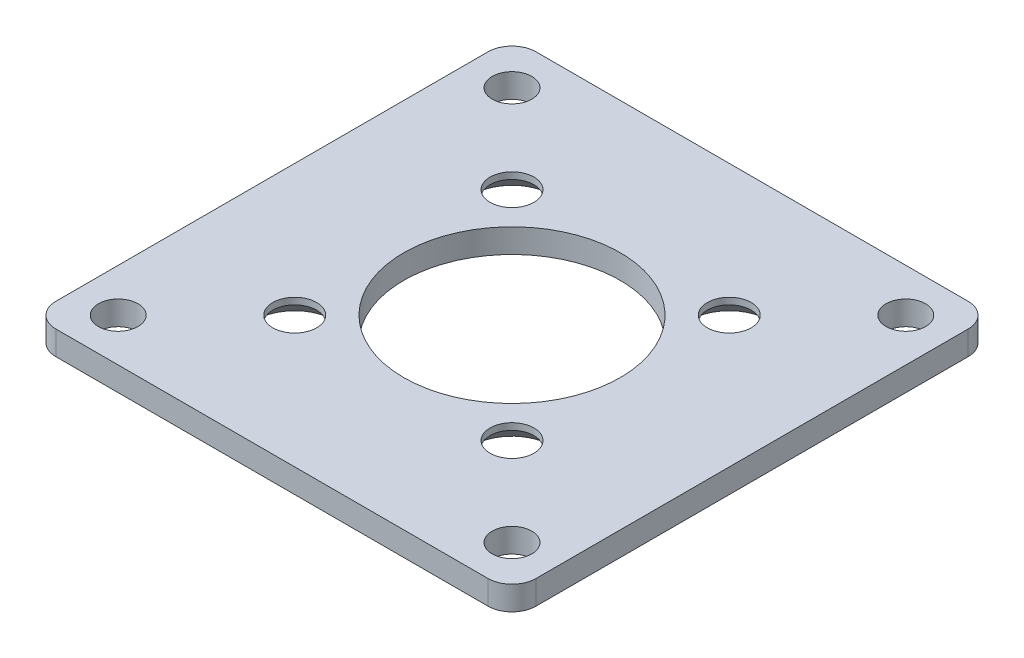
ISO-10303-21;
HEADER;
FILE_DESCRIPTION(('STEP AP214'),'2;1');
FILE_NAME('part.step','',(''),(''),'','','');
FILE_SCHEMA(('AUTOMOTIVE_DESIGN { 1 0 10303 214 1 1 1 1 }'));
ENDSEC;
DATA;
#1=APPLICATION_CONTEXT('core data for automotive mechanical design processes');
#2=APPLICATION_PROTOCOL_DEFINITION('international standard','automotive_design',2000,#1);
#3=PRODUCT_CONTEXT('',#1,'mechanical');
#4=PRODUCT('Part','Part','',(#3));
#5=PRODUCT_RELATED_PRODUCT_CATEGORY('part','',(#4));
#6=PRODUCT_DEFINITION_FORMATION('','',#4);
#7=PRODUCT_DEFINITION_CONTEXT('part definition',#1,'design');
#8=PRODUCT_DEFINITION('design','',#6,#7);
#9=PRODUCT_DEFINITION_SHAPE('','',#8);
#10=(LENGTH_UNIT() NAMED_UNIT(*) SI_UNIT(.MILLI.,.METRE.));
#11=(NAMED_UNIT(*) PLANE_ANGLE_UNIT() SI_UNIT($,.RADIAN.));
#12=(NAMED_UNIT(*) SI_UNIT($,.STERADIAN.) SOLID_ANGLE_UNIT());
#13=UNCERTAINTY_MEASURE_WITH_UNIT(LENGTH_MEASURE(1.E-05),#10,'distance_accuracy_value','');
#14=(GEOMETRIC_REPRESENTATION_CONTEXT(3) GLOBAL_UNCERTAINTY_ASSIGNED_CONTEXT((#13)) GLOBAL_UNIT_ASSIGNED_CONTEXT((#10,
#11,#12)) REPRESENTATION_CONTEXT('',''));
#15=CARTESIAN_POINT('',(0.,0.,0.));
#16=DIRECTION('',(0.,0.,1.));
#17=DIRECTION('',(1.,0.,0.));
#18=AXIS2_PLACEMENT_3D('',#15,#16,#17);
#19=CARTESIAN_POINT('',(-31.75,3.175,31.75));
#20=DIRECTION('',(1.,0.,0.));
#21=DIRECTION('',(0.,0.,-1.));
#22=AXIS2_PLACEMENT_3D('',#19,#20,#21);
#23=PLANE('',#22);
#24=DIRECTION('',(0.,0.,1.));
#25=VECTOR('',#24,1.);
#26=CARTESIAN_POINT('',(-31.75,0.,31.75));
#27=LINE('',#26,#25);
#28=CARTESIAN_POINT('',(-31.75,0.,-28.575));
#29=VERTEX_POINT('',#28);
#30=CARTESIAN_POINT('',(-31.75,0.,28.575));
#31=VERTEX_POINT('',#30);
#32=EDGE_CURVE('E126',#29,#31,#27,.T.);
#33=ORIENTED_EDGE('',*,*,#32,.T.);
#34=DIRECTION('',(0.,-1.,0.));
#35=VECTOR('',#34,1.);
#36=CARTESIAN_POINT('',(-31.75,3.175,28.575));
#37=LINE('',#36,#35);
#38=CARTESIAN_POINT('',(-31.75,3.175,28.575));
#39=VERTEX_POINT('',#38);
#40=EDGE_CURVE('E104',#31,#39,#37,.F.);
#41=ORIENTED_EDGE('',*,*,#40,.T.);
#42=DIRECTION('',(0.,0.,1.));
#43=VECTOR('',#42,1.);
#44=CARTESIAN_POINT('',(-31.75,3.175,31.75));
#45=LINE('',#44,#43);
#46=CARTESIAN_POINT('',(-31.75,3.175,-28.575));
#47=VERTEX_POINT('',#46);
#48=EDGE_CURVE('E136',#47,#39,#45,.T.);
#49=ORIENTED_EDGE('',*,*,#48,.F.);
#50=DIRECTION('',(0.,-1.,0.));
#51=VECTOR('',#50,1.);
#52=CARTESIAN_POINT('',(-31.75,3.175,-28.575));
#53=LINE('',#52,#51);
#54=EDGE_CURVE('E109',#47,#29,#53,.T.);
#55=ORIENTED_EDGE('',*,*,#54,.T.);
#56=EDGE_LOOP('',(#33,#41,#49,#55));
#57=FACE_BOUND('',#56,.T.);
#58=ADVANCED_FACE('F33',(#57),#23,.F.);
#59=CARTESIAN_POINT('',(31.75,3.175,31.75));
#60=DIRECTION('',(0.,0.,-1.));
#61=DIRECTION('',(-1.,0.,0.));
#62=AXIS2_PLACEMENT_3D('',#59,#60,#61);
#63=PLANE('',#62);
#64=DIRECTION('',(1.,0.,0.));
#65=VECTOR('',#64,1.);
#66=CARTESIAN_POINT('',(31.75,3.175,31.75));
#67=LINE('',#66,#65);
#68=CARTESIAN_POINT('',(-28.575,3.175,31.75));
#69=VERTEX_POINT('',#68);
#70=CARTESIAN_POINT('',(28.575,3.175,31.75));
#71=VERTEX_POINT('',#70);
#72=EDGE_CURVE('E119',#69,#71,#67,.T.);
#73=ORIENTED_EDGE('',*,*,#72,.F.);
#74=DIRECTION('',(0.,-1.,0.));
#75=VECTOR('',#74,1.);
#76=CARTESIAN_POINT('',(-28.575,3.175,31.75));
#77=LINE('',#76,#75);
#78=CARTESIAN_POINT('',(-28.575,0.,31.75));
#79=VERTEX_POINT('',#78);
#80=EDGE_CURVE('E103',#69,#79,#77,.T.);
#81=ORIENTED_EDGE('',*,*,#80,.T.);
#82=DIRECTION('',(1.,0.,0.));
#83=VECTOR('',#82,1.);
#84=CARTESIAN_POINT('',(31.75,0.,31.75));
#85=LINE('',#84,#83);
#86=CARTESIAN_POINT('',(28.575,0.,31.75));
#87=VERTEX_POINT('',#86);
#88=EDGE_CURVE('E116',#79,#87,#85,.T.);
#89=ORIENTED_EDGE('',*,*,#88,.T.);
#90=DIRECTION('',(0.,-1.,0.));
#91=VECTOR('',#90,1.);
#92=CARTESIAN_POINT('',(28.575,3.175,31.75));
#93=LINE('',#92,#91);
#94=EDGE_CURVE('E121',#87,#71,#93,.F.);
#95=ORIENTED_EDGE('',*,*,#94,.T.);
#96=EDGE_LOOP('',(#73,#81,#89,#95));
#97=FACE_BOUND('',#96,.T.);
#98=ADVANCED_FACE('F115',(#97),#63,.F.);
#99=CARTESIAN_POINT('',(31.75,3.175,31.75));
#100=DIRECTION('',(-1.,0.,0.));
#101=DIRECTION('',(0.,0.,1.));
#102=AXIS2_PLACEMENT_3D('',#99,#100,#101);
#103=PLANE('',#102);
#104=DIRECTION('',(0.,0.,-1.));
#105=VECTOR('',#104,1.);
#106=CARTESIAN_POINT('',(31.75,3.175,31.75));
#107=LINE('',#106,#105);
#108=CARTESIAN_POINT('',(31.75,3.175,28.575));
#109=VERTEX_POINT('',#108);
#110=CARTESIAN_POINT('',(31.75,3.175,-28.575));
#111=VERTEX_POINT('',#110);
#112=EDGE_CURVE('E182',#109,#111,#107,.T.);
#113=ORIENTED_EDGE('',*,*,#112,.F.);
#114=DIRECTION('',(0.,-1.,0.));
#115=VECTOR('',#114,1.);
#116=CARTESIAN_POINT('',(31.75,3.175,28.575));
#117=LINE('',#116,#115);
#118=CARTESIAN_POINT('',(31.75,0.,28.575));
#119=VERTEX_POINT('',#118);
#120=EDGE_CURVE('E175',#109,#119,#117,.T.);
#121=ORIENTED_EDGE('',*,*,#120,.T.);
#122=DIRECTION('',(0.,0.,-1.));
#123=VECTOR('',#122,1.);
#124=CARTESIAN_POINT('',(31.75,0.,31.75));
#125=LINE('',#124,#123);
#126=CARTESIAN_POINT('',(31.75,0.,-28.575));
#127=VERTEX_POINT('',#126);
#128=EDGE_CURVE('E125',#119,#127,#125,.T.);
#129=ORIENTED_EDGE('',*,*,#128,.T.);
#130=DIRECTION('',(0.,-1.,0.));
#131=VECTOR('',#130,1.);
#132=CARTESIAN_POINT('',(31.75,3.175,-28.575));
#133=LINE('',#132,#131);
#134=EDGE_CURVE('E173',#127,#111,#133,.F.);
#135=ORIENTED_EDGE('',*,*,#134,.T.);
#136=EDGE_LOOP('',(#113,#121,#129,#135));
#137=FACE_BOUND('',#136,.T.);
#138=ADVANCED_FACE('F180',(#137),#103,.F.);
#139=CARTESIAN_POINT('',(31.75,3.175,-31.75));
#140=DIRECTION('',(0.,0.,1.));
#141=DIRECTION('',(1.,0.,0.));
#142=AXIS2_PLACEMENT_3D('',#139,#140,#141);
#143=PLANE('',#142);
#144=DIRECTION('',(-1.,0.,0.));
#145=VECTOR('',#144,1.);
#146=CARTESIAN_POINT('',(31.75,3.175,-31.75));
#147=LINE('',#146,#145);
#148=CARTESIAN_POINT('',(28.575,3.175,-31.75));
#149=VERTEX_POINT('',#148);
#150=CARTESIAN_POINT('',(-28.575,3.175,-31.75));
#151=VERTEX_POINT('',#150);
#152=EDGE_CURVE('E157',#149,#151,#147,.T.);
#153=ORIENTED_EDGE('',*,*,#152,.F.);
#154=DIRECTION('',(0.,-1.,0.));
#155=VECTOR('',#154,1.);
#156=CARTESIAN_POINT('',(28.575,3.175,-31.75));
#157=LINE('',#156,#155);
#158=CARTESIAN_POINT('',(28.575,0.,-31.75));
#159=VERTEX_POINT('',#158);
#160=EDGE_CURVE('E11',#149,#159,#157,.T.);
#161=ORIENTED_EDGE('',*,*,#160,.T.);
#162=DIRECTION('',(-1.,0.,0.));
#163=VECTOR('',#162,1.);
#164=CARTESIAN_POINT('',(31.75,0.,-31.75));
#165=LINE('',#164,#163);
#166=CARTESIAN_POINT('',(-28.575,0.,-31.75));
#167=VERTEX_POINT('',#166);
#168=EDGE_CURVE('E129',#159,#167,#165,.T.);
#169=ORIENTED_EDGE('',*,*,#168,.T.);
#170=DIRECTION('',(0.,-1.,0.));
#171=VECTOR('',#170,1.);
#172=CARTESIAN_POINT('',(-28.575,3.175,-31.75));
#173=LINE('',#172,#171);
#174=EDGE_CURVE('E41',#167,#151,#173,.F.);
#175=ORIENTED_EDGE('',*,*,#174,.T.);
#176=EDGE_LOOP('',(#153,#161,#169,#175));
#177=FACE_BOUND('',#176,.T.);
#178=ADVANCED_FACE('F189',(#177),#143,.F.);
#179=CARTESIAN_POINT('',(0.,3.175,0.));
#180=DIRECTION('',(0.,1.,0.));
#181=DIRECTION('',(0.,0.,1.));
#182=AXIS2_PLACEMENT_3D('',#179,#180,#181);
#183=PLANE('',#182);
#184=CARTESIAN_POINT('',(-26.0427427511007,3.175,26.0427427511007));
#185=DIRECTION('',(0.,1.,0.));
#186=DIRECTION('',(0.,0.,1.));
#187=AXIS2_PLACEMENT_3D('',#184,#185,#186);
#188=CIRCLE('',#187,2.6162);
#189=CARTESIAN_POINT('',(-26.0427427511007,3.175,28.6589427511007));
#190=VERTEX_POINT('',#189);
#191=EDGE_CURVE('E224',#190,#190,#188,.F.);
#192=ORIENTED_EDGE('',*,*,#191,.T.);
#193=EDGE_LOOP('',(#192));
#194=FACE_BOUND('',#193,.T.);
#195=CARTESIAN_POINT('',(-26.0427427511008,3.175,-26.0427427511005));
#196=DIRECTION('',(0.,1.,0.));
#197=DIRECTION('',(0.,0.,1.));
#198=AXIS2_PLACEMENT_3D('',#195,#196,#197);
#199=CIRCLE('',#198,2.6162);
#200=CARTESIAN_POINT('',(-26.0427427511008,3.175,-23.4265427511005));
#201=VERTEX_POINT('',#200);
#202=EDGE_CURVE('E230',#201,#201,#199,.F.);
#203=ORIENTED_EDGE('',*,*,#202,.T.);
#204=EDGE_LOOP('',(#203));
#205=FACE_BOUND('',#204,.T.);
#206=CARTESIAN_POINT('',(26.0427427511004,3.175,-26.0427427511007));
#207=DIRECTION('',(0.,1.,0.));
#208=DIRECTION('',(0.,0.,1.));
#209=AXIS2_PLACEMENT_3D('',#206,#207,#208);
#210=CIRCLE('',#209,2.6162);
#211=CARTESIAN_POINT('',(26.0427427511004,3.175,-23.4265427511007));
#212=VERTEX_POINT('',#211);
#213=EDGE_CURVE('E236',#212,#212,#210,.F.);
#214=ORIENTED_EDGE('',*,*,#213,.T.);
#215=EDGE_LOOP('',(#214));
#216=FACE_BOUND('',#215,.T.);
#217=CARTESIAN_POINT('',(26.0427427511005,3.175,26.0427427511005));
#218=DIRECTION('',(0.,1.,0.));
#219=DIRECTION('',(0.,0.,1.));
#220=AXIS2_PLACEMENT_3D('',#217,#218,#219);
#221=CIRCLE('',#220,2.6162);
#222=CARTESIAN_POINT('',(26.0427427511005,3.175,28.6589427511005));
#223=VERTEX_POINT('',#222);
#224=EDGE_CURVE('E218',#223,#223,#221,.F.);
#225=ORIENTED_EDGE('',*,*,#224,.T.);
#226=EDGE_LOOP('',(#225));
#227=FACE_BOUND('',#226,.T.);
#228=CARTESIAN_POINT('',(-14.3684097937107,3.175,14.3684097937106));
#229=DIRECTION('',(0.,1.,0.));
#230=DIRECTION('',(0.,0.,1.));
#231=AXIS2_PLACEMENT_3D('',#228,#229,#230);
#232=CIRCLE('',#231,2.9);
#233=CARTESIAN_POINT('',(-14.3684097937107,3.175,17.2684097937106));
#234=VERTEX_POINT('',#233);
#235=EDGE_CURVE('E152',#234,#234,#232,.T.);
#236=ORIENTED_EDGE('',*,*,#235,.F.);
#237=EDGE_LOOP('',(#236));
#238=FACE_BOUND('',#237,.T.);
#239=CARTESIAN_POINT('',(14.3684097937106,3.175,14.3684097937107));
#240=DIRECTION('',(0.,1.,0.));
#241=DIRECTION('',(0.,0.,1.));
#242=AXIS2_PLACEMENT_3D('',#239,#240,#241);
#243=CIRCLE('',#242,2.9);
#244=CARTESIAN_POINT('',(14.3684097937106,3.175,17.2684097937107));
#245=VERTEX_POINT('',#244);
#246=EDGE_CURVE('E147',#245,#245,#243,.T.);
#247=ORIENTED_EDGE('',*,*,#246,.F.);
#248=EDGE_LOOP('',(#247));
#249=FACE_BOUND('',#248,.T.);
#250=CARTESIAN_POINT('',(14.3684097937107,3.175,-14.3684097937106));
#251=DIRECTION('',(0.,1.,0.));
#252=DIRECTION('',(0.,0.,1.));
#253=AXIS2_PLACEMENT_3D('',#250,#251,#252);
#254=CIRCLE('',#253,2.9);
#255=CARTESIAN_POINT('',(14.3684097937107,3.175,-11.4684097937106));
#256=VERTEX_POINT('',#255);
#257=EDGE_CURVE('E142',#256,#256,#254,.T.);
#258=ORIENTED_EDGE('',*,*,#257,.F.);
#259=EDGE_LOOP('',(#258));
#260=FACE_BOUND('',#259,.T.);
#261=CARTESIAN_POINT('',(-14.3684097937106,3.175,-14.3684097937107));
#262=DIRECTION('',(0.,1.,0.));
#263=DIRECTION('',(0.,0.,1.));
#264=AXIS2_PLACEMENT_3D('',#261,#262,#263);
#265=CIRCLE('',#264,2.9);
#266=CARTESIAN_POINT('',(-14.3684097937106,3.175,-11.4684097937107));
#267=VERTEX_POINT('',#266);
#268=EDGE_CURVE('E137',#267,#267,#265,.T.);
#269=ORIENTED_EDGE('',*,*,#268,.F.);
#270=EDGE_LOOP('',(#269));
#271=FACE_BOUND('',#270,.T.);
#272=CARTESIAN_POINT('',(0.,3.175,0.));
#273=DIRECTION('',(0.,1.,0.));
#274=DIRECTION('',(0.,0.,1.));
#275=AXIS2_PLACEMENT_3D('',#272,#273,#274);
#276=CIRCLE('',#275,14.3129);
#277=CARTESIAN_POINT('',(0.,3.175,14.3129));
#278=VERTEX_POINT('',#277);
#279=EDGE_CURVE('E140',#278,#278,#276,.T.);
#280=ORIENTED_EDGE('',*,*,#279,.F.);
#281=EDGE_LOOP('',(#280));
#282=FACE_BOUND('',#281,.T.);
#283=ORIENTED_EDGE('',*,*,#48,.T.);
#284=CARTESIAN_POINT('',(-28.575,3.175,28.575));
#285=DIRECTION('',(0.,1.,0.));
#286=DIRECTION('',(0.,0.,1.));
#287=AXIS2_PLACEMENT_3D('',#284,#285,#286);
#288=CIRCLE('',#287,3.175);
#289=EDGE_CURVE('E171',#39,#69,#288,.T.);
#290=ORIENTED_EDGE('',*,*,#289,.T.);
#291=ORIENTED_EDGE('',*,*,#72,.T.);
#292=CARTESIAN_POINT('',(28.575,3.175,28.575));
#293=DIRECTION('',(0.,1.,0.));
#294=DIRECTION('',(0.,0.,1.));
#295=AXIS2_PLACEMENT_3D('',#292,#293,#294);
#296=CIRCLE('',#295,3.175);
#297=EDGE_CURVE('E169',#71,#109,#296,.T.);
#298=ORIENTED_EDGE('',*,*,#297,.T.);
#299=ORIENTED_EDGE('',*,*,#112,.T.);
#300=CARTESIAN_POINT('',(28.575,3.175,-28.575));
#301=DIRECTION('',(0.,1.,0.));
#302=DIRECTION('',(0.,0.,1.));
#303=AXIS2_PLACEMENT_3D('',#300,#301,#302);
#304=CIRCLE('',#303,3.175);
#305=EDGE_CURVE('E54',#111,#149,#304,.T.);
#306=ORIENTED_EDGE('',*,*,#305,.T.);
#307=ORIENTED_EDGE('',*,*,#152,.T.);
#308=CARTESIAN_POINT('',(-28.575,3.175,-28.575));
#309=DIRECTION('',(0.,1.,0.));
#310=DIRECTION('',(0.,0.,1.));
#311=AXIS2_PLACEMENT_3D('',#308,#309,#310);
#312=CIRCLE('',#311,3.175);
#313=EDGE_CURVE('E166',#151,#47,#312,.T.);
#314=ORIENTED_EDGE('',*,*,#313,.T.);
#315=EDGE_LOOP('',(#283,#290,#291,#298,#299,#306,#307,#314));
#316=FACE_BOUND('',#315,.T.);
#317=ADVANCED_FACE('F247',(#194,#205,#216,#227,#238,#249,#260,#271,#282,#316),#183,.T.);
#318=CARTESIAN_POINT('',(0.,0.,0.));
#319=DIRECTION('',(0.,1.,0.));
#320=DIRECTION('',(0.,0.,1.));
#321=AXIS2_PLACEMENT_3D('',#318,#319,#320);
#322=PLANE('',#321);
#323=CARTESIAN_POINT('',(-26.0427427511007,0.,26.0427427511007));
#324=DIRECTION('',(0.,-1.,0.));
#325=DIRECTION('',(0.,0.,-1.));
#326=AXIS2_PLACEMENT_3D('',#323,#324,#325);
#327=CIRCLE('',#326,2.6162);
#328=CARTESIAN_POINT('',(-26.0427427511007,0.,23.4265427511007));
#329=VERTEX_POINT('',#328);
#330=EDGE_CURVE('E227',#329,#329,#327,.T.);
#331=ORIENTED_EDGE('',*,*,#330,.F.);
#332=EDGE_LOOP('',(#331));
#333=FACE_BOUND('',#332,.T.);
#334=CARTESIAN_POINT('',(-26.0427427511008,0.,-26.0427427511005));
#335=DIRECTION('',(0.,-1.,0.));
#336=DIRECTION('',(0.,0.,-1.));
#337=AXIS2_PLACEMENT_3D('',#334,#335,#336);
#338=CIRCLE('',#337,2.6162);
#339=CARTESIAN_POINT('',(-26.0427427511008,0.,-28.6589427511005));
#340=VERTEX_POINT('',#339);
#341=EDGE_CURVE('E233',#340,#340,#338,.T.);
#342=ORIENTED_EDGE('',*,*,#341,.F.);
#343=EDGE_LOOP('',(#342));
#344=FACE_BOUND('',#343,.T.);
#345=CARTESIAN_POINT('',(26.0427427511004,0.,-26.0427427511007));
#346=DIRECTION('',(0.,-1.,0.));
#347=DIRECTION('',(0.,0.,-1.));
#348=AXIS2_PLACEMENT_3D('',#345,#346,#347);
#349=CIRCLE('',#348,2.6162);
#350=CARTESIAN_POINT('',(26.0427427511004,0.,-28.6589427511007));
#351=VERTEX_POINT('',#350);
#352=EDGE_CURVE('E221',#351,#351,#349,.T.);
#353=ORIENTED_EDGE('',*,*,#352,.F.);
#354=EDGE_LOOP('',(#353));
#355=FACE_BOUND('',#354,.T.);
#356=CARTESIAN_POINT('',(26.0427427511005,0.,26.0427427511005));
#357=DIRECTION('',(0.,-1.,0.));
#358=DIRECTION('',(0.,0.,-1.));
#359=AXIS2_PLACEMENT_3D('',#356,#357,#358);
#360=CIRCLE('',#359,2.6162);
#361=CARTESIAN_POINT('',(26.0427427511005,0.,23.4265427511005));
#362=VERTEX_POINT('',#361);
#363=EDGE_CURVE('E217',#362,#362,#360,.T.);
#364=ORIENTED_EDGE('',*,*,#363,.F.);
#365=EDGE_LOOP('',(#364));
#366=FACE_BOUND('',#365,.T.);
#367=CARTESIAN_POINT('',(-14.3684097937107,0.,14.3684097937106));
#368=DIRECTION('',(0.,-1.,0.));
#369=DIRECTION('',(0.,0.,-1.));
#370=AXIS2_PLACEMENT_3D('',#367,#368,#369);
#371=CIRCLE('',#370,5.2);
#372=CARTESIAN_POINT('',(-14.3684097937107,0.,9.16840979371064));
#373=VERTEX_POINT('',#372);
#374=EDGE_CURVE('E214',#373,#373,#371,.T.);
#375=ORIENTED_EDGE('',*,*,#374,.F.);
#376=EDGE_LOOP('',(#375));
#377=FACE_BOUND('',#376,.T.);
#378=CARTESIAN_POINT('',(14.3684097937106,0.,14.3684097937107));
#379=DIRECTION('',(0.,-1.,0.));
#380=DIRECTION('',(0.,0.,-1.));
#381=AXIS2_PLACEMENT_3D('',#378,#379,#380);
#382=CIRCLE('',#381,5.2);
#383=CARTESIAN_POINT('',(14.3684097937106,0.,9.16840979371066));
#384=VERTEX_POINT('',#383);
#385=EDGE_CURVE('E155',#384,#384,#382,.T.);
#386=ORIENTED_EDGE('',*,*,#385,.F.);
#387=EDGE_LOOP('',(#386));
#388=FACE_BOUND('',#387,.T.);
#389=CARTESIAN_POINT('',(14.3684097937107,0.,-14.3684097937106));
#390=DIRECTION('',(0.,-1.,0.));
#391=DIRECTION('',(0.,0.,-1.));
#392=AXIS2_PLACEMENT_3D('',#389,#390,#391);
#393=CIRCLE('',#392,5.2);
#394=CARTESIAN_POINT('',(14.3684097937107,0.,-19.5684097937106));
#395=VERTEX_POINT('',#394);
#396=EDGE_CURVE('E150',#395,#395,#393,.T.);
#397=ORIENTED_EDGE('',*,*,#396,.F.);
#398=EDGE_LOOP('',(#397));
#399=FACE_BOUND('',#398,.T.);
#400=CARTESIAN_POINT('',(-14.3684097937106,0.,-14.3684097937107));
#401=DIRECTION('',(0.,-1.,0.));
#402=DIRECTION('',(0.,0.,-1.));
#403=AXIS2_PLACEMENT_3D('',#400,#401,#402);
#404=CIRCLE('',#403,5.2);
#405=CARTESIAN_POINT('',(-14.3684097937106,0.,-19.5684097937107));
#406=VERTEX_POINT('',#405);
#407=EDGE_CURVE('E145',#406,#406,#404,.T.);
#408=ORIENTED_EDGE('',*,*,#407,.F.);
#409=EDGE_LOOP('',(#408));
#410=FACE_BOUND('',#409,.T.);
#411=CARTESIAN_POINT('',(0.,0.,0.));
#412=DIRECTION('',(0.,1.,0.));
#413=DIRECTION('',(0.,0.,1.));
#414=AXIS2_PLACEMENT_3D('',#411,#412,#413);
#415=CIRCLE('',#414,14.3129);
#416=CARTESIAN_POINT('',(0.,0.,14.3129));
#417=VERTEX_POINT('',#416);
#418=EDGE_CURVE('E131',#417,#417,#415,.F.);
#419=ORIENTED_EDGE('',*,*,#418,.F.);
#420=EDGE_LOOP('',(#419));
#421=FACE_BOUND('',#420,.T.);
#422=ORIENTED_EDGE('',*,*,#88,.F.);
#423=CARTESIAN_POINT('',(-28.575,0.,28.575));
#424=DIRECTION('',(0.,1.,0.));
#425=DIRECTION('',(0.,0.,1.));
#426=AXIS2_PLACEMENT_3D('',#423,#424,#425);
#427=CIRCLE('',#426,3.175);
#428=EDGE_CURVE('E99',#79,#31,#427,.F.);
#429=ORIENTED_EDGE('',*,*,#428,.T.);
#430=ORIENTED_EDGE('',*,*,#32,.F.);
#431=CARTESIAN_POINT('',(-28.575,0.,-28.575));
#432=DIRECTION('',(0.,1.,0.));
#433=DIRECTION('',(0.,0.,1.));
#434=AXIS2_PLACEMENT_3D('',#431,#432,#433);
#435=CIRCLE('',#434,3.175);
#436=EDGE_CURVE('E120',#29,#167,#435,.F.);
#437=ORIENTED_EDGE('',*,*,#436,.T.);
#438=ORIENTED_EDGE('',*,*,#168,.F.);
#439=CARTESIAN_POINT('',(28.575,0.,-28.575));
#440=DIRECTION('',(0.,1.,0.));
#441=DIRECTION('',(0.,0.,1.));
#442=AXIS2_PLACEMENT_3D('',#439,#440,#441);
#443=CIRCLE('',#442,3.175);
#444=EDGE_CURVE('E160',#159,#127,#443,.F.);
#445=ORIENTED_EDGE('',*,*,#444,.T.);
#446=ORIENTED_EDGE('',*,*,#128,.F.);
#447=CARTESIAN_POINT('',(28.575,0.,28.575));
#448=DIRECTION('',(0.,1.,0.));
#449=DIRECTION('',(0.,0.,1.));
#450=AXIS2_PLACEMENT_3D('',#447,#448,#449);
#451=CIRCLE('',#450,3.175);
#452=EDGE_CURVE('E110',#119,#87,#451,.F.);
#453=ORIENTED_EDGE('',*,*,#452,.T.);
#454=EDGE_LOOP('',(#422,#429,#430,#437,#438,#445,#446,#453));
#455=FACE_BOUND('',#454,.T.);
#456=ADVANCED_FACE('F123',(#333,#344,#355,#366,#377,#388,#399,#410,#421,#455),#322,.F.);
#457=CARTESIAN_POINT('',(0.,-0.00100000000000013,0.));
#458=DIRECTION('',(0.,1.,0.));
#459=DIRECTION('',(0.,0.,1.));
#460=AXIS2_PLACEMENT_3D('',#457,#458,#459);
#461=CYLINDRICAL_SURFACE('',#460,14.3129);
#462=ORIENTED_EDGE('',*,*,#279,.T.);
#463=EDGE_LOOP('',(#462));
#464=FACE_BOUND('',#463,.T.);
#465=ORIENTED_EDGE('',*,*,#418,.T.);
#466=EDGE_LOOP('',(#465));
#467=FACE_BOUND('',#466,.T.);
#468=ADVANCED_FACE('F246',(#464,#467),#461,.F.);
#469=CARTESIAN_POINT('',(-14.3684097937106,0.,-14.3684097937107));
#470=DIRECTION('',(0.,-1.,0.));
#471=DIRECTION('',(0.,0.,-1.));
#472=AXIS2_PLACEMENT_3D('',#469,#470,#471);
#473=CYLINDRICAL_SURFACE('',#472,2.9);
#474=ORIENTED_EDGE('',*,*,#268,.T.);
#475=EDGE_LOOP('',(#474));
#476=FACE_BOUND('',#475,.T.);
#477=CARTESIAN_POINT('',(-14.3684097937106,2.3,-14.3684097937107));
#478=DIRECTION('',(0.,-1.,0.));
#479=DIRECTION('',(0.,0.,-1.));
#480=AXIS2_PLACEMENT_3D('',#477,#478,#479);
#481=CIRCLE('',#480,2.9);
#482=CARTESIAN_POINT('',(-14.3684097937106,2.3,-17.2684097937107));
#483=VERTEX_POINT('',#482);
#484=EDGE_CURVE('E141',#483,#483,#481,.T.);
#485=ORIENTED_EDGE('',*,*,#484,.T.);
#486=EDGE_LOOP('',(#485));
#487=FACE_BOUND('',#486,.T.);
#488=ADVANCED_FACE('F263',(#476,#487),#473,.F.);
#489=CARTESIAN_POINT('',(-14.3684097937106,0.,-14.3684097937107));
#490=DIRECTION('',(0.,-1.,0.));
#491=DIRECTION('',(0.,0.,-1.));
#492=AXIS2_PLACEMENT_3D('',#489,#490,#491);
#493=CONICAL_SURFACE('',#492,5.2,0.785398163397448);
#494=ORIENTED_EDGE('',*,*,#484,.F.);
#495=EDGE_LOOP('',(#494));
#496=FACE_BOUND('',#495,.T.);
#497=ORIENTED_EDGE('',*,*,#407,.T.);
#498=EDGE_LOOP('',(#497));
#499=FACE_BOUND('',#498,.T.);
#500=ADVANCED_FACE('F269',(#496,#499),#493,.F.);
#501=CARTESIAN_POINT('',(14.3684097937107,0.,-14.3684097937106));
#502=DIRECTION('',(0.,-1.,0.));
#503=DIRECTION('',(0.,0.,-1.));
#504=AXIS2_PLACEMENT_3D('',#501,#502,#503);
#505=CYLINDRICAL_SURFACE('',#504,2.9);
#506=ORIENTED_EDGE('',*,*,#257,.T.);
#507=EDGE_LOOP('',(#506));
#508=FACE_BOUND('',#507,.T.);
#509=CARTESIAN_POINT('',(14.3684097937107,2.3,-14.3684097937106));
#510=DIRECTION('',(0.,-1.,0.));
#511=DIRECTION('',(0.,0.,-1.));
#512=AXIS2_PLACEMENT_3D('',#509,#510,#511);
#513=CIRCLE('',#512,2.9);
#514=CARTESIAN_POINT('',(14.3684097937107,2.3,-17.2684097937106));
#515=VERTEX_POINT('',#514);
#516=EDGE_CURVE('E146',#515,#515,#513,.T.);
#517=ORIENTED_EDGE('',*,*,#516,.T.);
#518=EDGE_LOOP('',(#517));
#519=FACE_BOUND('',#518,.T.);
#520=ADVANCED_FACE('F408',(#508,#519),#505,.F.);
#521=CARTESIAN_POINT('',(14.3684097937107,0.,-14.3684097937106));
#522=DIRECTION('',(0.,-1.,0.));
#523=DIRECTION('',(0.,0.,-1.));
#524=AXIS2_PLACEMENT_3D('',#521,#522,#523);
#525=CONICAL_SURFACE('',#524,5.2,0.785398163397448);
#526=ORIENTED_EDGE('',*,*,#516,.F.);
#527=EDGE_LOOP('',(#526));
#528=FACE_BOUND('',#527,.T.);
#529=ORIENTED_EDGE('',*,*,#396,.T.);
#530=EDGE_LOOP('',(#529));
#531=FACE_BOUND('',#530,.T.);
#532=ADVANCED_FACE('F404',(#528,#531),#525,.F.);
#533=CARTESIAN_POINT('',(14.3684097937106,0.,14.3684097937107));
#534=DIRECTION('',(0.,-1.,0.));
#535=DIRECTION('',(0.,0.,-1.));
#536=AXIS2_PLACEMENT_3D('',#533,#534,#535);
#537=CYLINDRICAL_SURFACE('',#536,2.9);
#538=ORIENTED_EDGE('',*,*,#246,.T.);
#539=EDGE_LOOP('',(#538));
#540=FACE_BOUND('',#539,.T.);
#541=CARTESIAN_POINT('',(14.3684097937106,2.3,14.3684097937107));
#542=DIRECTION('',(0.,-1.,0.));
#543=DIRECTION('',(0.,0.,-1.));
#544=AXIS2_PLACEMENT_3D('',#541,#542,#543);
#545=CIRCLE('',#544,2.9);
#546=CARTESIAN_POINT('',(14.3684097937106,2.3,11.4684097937107));
#547=VERTEX_POINT('',#546);
#548=EDGE_CURVE('E151',#547,#547,#545,.T.);
#549=ORIENTED_EDGE('',*,*,#548,.T.);
#550=EDGE_LOOP('',(#549));
#551=FACE_BOUND('',#550,.T.);
#552=ADVANCED_FACE('F400',(#540,#551),#537,.F.);
#553=CARTESIAN_POINT('',(14.3684097937106,0.,14.3684097937107));
#554=DIRECTION('',(0.,-1.,0.));
#555=DIRECTION('',(0.,0.,-1.));
#556=AXIS2_PLACEMENT_3D('',#553,#554,#555);
#557=CONICAL_SURFACE('',#556,5.2,0.785398163397449);
#558=ORIENTED_EDGE('',*,*,#548,.F.);
#559=EDGE_LOOP('',(#558));
#560=FACE_BOUND('',#559,.T.);
#561=ORIENTED_EDGE('',*,*,#385,.T.);
#562=EDGE_LOOP('',(#561));
#563=FACE_BOUND('',#562,.T.);
#564=ADVANCED_FACE('F396',(#560,#563),#557,.F.);
#565=CARTESIAN_POINT('',(-14.3684097937107,0.,14.3684097937106));
#566=DIRECTION('',(0.,-1.,0.));
#567=DIRECTION('',(0.,0.,-1.));
#568=AXIS2_PLACEMENT_3D('',#565,#566,#567);
#569=CYLINDRICAL_SURFACE('',#568,2.9);
#570=ORIENTED_EDGE('',*,*,#235,.T.);
#571=EDGE_LOOP('',(#570));
#572=FACE_BOUND('',#571,.T.);
#573=CARTESIAN_POINT('',(-14.3684097937107,2.3,14.3684097937106));
#574=DIRECTION('',(0.,-1.,0.));
#575=DIRECTION('',(0.,0.,-1.));
#576=AXIS2_PLACEMENT_3D('',#573,#574,#575);
#577=CIRCLE('',#576,2.9);
#578=CARTESIAN_POINT('',(-14.3684097937107,2.3,11.4684097937106));
#579=VERTEX_POINT('',#578);
#580=EDGE_CURVE('E156',#579,#579,#577,.T.);
#581=ORIENTED_EDGE('',*,*,#580,.T.);
#582=EDGE_LOOP('',(#581));
#583=FACE_BOUND('',#582,.T.);
#584=ADVANCED_FACE('F392',(#572,#583),#569,.F.);
#585=CARTESIAN_POINT('',(-14.3684097937107,0.,14.3684097937106));
#586=DIRECTION('',(0.,-1.,0.));
#587=DIRECTION('',(0.,0.,-1.));
#588=AXIS2_PLACEMENT_3D('',#585,#586,#587);
#589=CONICAL_SURFACE('',#588,5.2,0.785398163397449);
#590=ORIENTED_EDGE('',*,*,#580,.F.);
#591=EDGE_LOOP('',(#590));
#592=FACE_BOUND('',#591,.T.);
#593=ORIENTED_EDGE('',*,*,#374,.T.);
#594=EDGE_LOOP('',(#593));
#595=FACE_BOUND('',#594,.T.);
#596=ADVANCED_FACE('F285',(#592,#595),#589,.F.);
#597=CARTESIAN_POINT('',(-28.575,3.175,28.575));
#598=DIRECTION('',(0.,-1.,0.));
#599=DIRECTION('',(0.,0.,-1.));
#600=AXIS2_PLACEMENT_3D('',#597,#598,#599);
#601=CYLINDRICAL_SURFACE('',#600,3.175);
#602=ORIENTED_EDGE('',*,*,#289,.F.);
#603=ORIENTED_EDGE('',*,*,#40,.F.);
#604=ORIENTED_EDGE('',*,*,#428,.F.);
#605=ORIENTED_EDGE('',*,*,#80,.F.);
#606=EDGE_LOOP('',(#602,#603,#604,#605));
#607=FACE_BOUND('',#606,.T.);
#608=ADVANCED_FACE('F102',(#607),#601,.T.);
#609=CARTESIAN_POINT('',(28.575,3.175,28.575));
#610=DIRECTION('',(0.,-1.,0.));
#611=DIRECTION('',(0.,0.,-1.));
#612=AXIS2_PLACEMENT_3D('',#609,#610,#611);
#613=CYLINDRICAL_SURFACE('',#612,3.175);
#614=ORIENTED_EDGE('',*,*,#297,.F.);
#615=ORIENTED_EDGE('',*,*,#94,.F.);
#616=ORIENTED_EDGE('',*,*,#452,.F.);
#617=ORIENTED_EDGE('',*,*,#120,.F.);
#618=EDGE_LOOP('',(#614,#615,#616,#617));
#619=FACE_BOUND('',#618,.T.);
#620=ADVANCED_FACE('F284',(#619),#613,.T.);
#621=CARTESIAN_POINT('',(28.575,3.175,-28.575));
#622=DIRECTION('',(0.,-1.,0.));
#623=DIRECTION('',(0.,0.,-1.));
#624=AXIS2_PLACEMENT_3D('',#621,#622,#623);
#625=CYLINDRICAL_SURFACE('',#624,3.175);
#626=ORIENTED_EDGE('',*,*,#305,.F.);
#627=ORIENTED_EDGE('',*,*,#134,.F.);
#628=ORIENTED_EDGE('',*,*,#444,.F.);
#629=ORIENTED_EDGE('',*,*,#160,.F.);
#630=EDGE_LOOP('',(#626,#627,#628,#629));
#631=FACE_BOUND('',#630,.T.);
#632=ADVANCED_FACE('F188',(#631),#625,.T.);
#633=CARTESIAN_POINT('',(-28.575,3.175,-28.575));
#634=DIRECTION('',(0.,-1.,0.));
#635=DIRECTION('',(0.,0.,-1.));
#636=AXIS2_PLACEMENT_3D('',#633,#634,#635);
#637=CYLINDRICAL_SURFACE('',#636,3.175);
#638=ORIENTED_EDGE('',*,*,#313,.F.);
#639=ORIENTED_EDGE('',*,*,#174,.F.);
#640=ORIENTED_EDGE('',*,*,#436,.F.);
#641=ORIENTED_EDGE('',*,*,#54,.F.);
#642=EDGE_LOOP('',(#638,#639,#640,#641));
#643=FACE_BOUND('',#642,.T.);
#644=ADVANCED_FACE('F35',(#643),#637,.T.);
#645=CARTESIAN_POINT('',(26.0427427511005,3.176,26.0427427511005));
#646=DIRECTION('',(0.,-1.,0.));
#647=DIRECTION('',(0.,0.,-1.));
#648=AXIS2_PLACEMENT_3D('',#645,#646,#647);
#649=CYLINDRICAL_SURFACE('',#648,2.6162);
#650=ORIENTED_EDGE('',*,*,#224,.F.);
#651=EDGE_LOOP('',(#650));
#652=FACE_BOUND('',#651,.T.);
#653=ORIENTED_EDGE('',*,*,#363,.T.);
#654=EDGE_LOOP('',(#653));
#655=FACE_BOUND('',#654,.T.);
#656=ADVANCED_FACE('F291',(#652,#655),#649,.F.);
#657=CARTESIAN_POINT('',(26.0427427511004,3.176,-26.0427427511007));
#658=DIRECTION('',(0.,-1.,0.));
#659=DIRECTION('',(0.,0.,-1.));
#660=AXIS2_PLACEMENT_3D('',#657,#658,#659);
#661=CYLINDRICAL_SURFACE('',#660,2.6162);
#662=ORIENTED_EDGE('',*,*,#213,.F.);
#663=EDGE_LOOP('',(#662));
#664=FACE_BOUND('',#663,.T.);
#665=ORIENTED_EDGE('',*,*,#352,.T.);
#666=EDGE_LOOP('',(#665));
#667=FACE_BOUND('',#666,.T.);
#668=ADVANCED_FACE('F242',(#664,#667),#661,.F.);
#669=CARTESIAN_POINT('',(-26.0427427511008,3.176,-26.0427427511005));
#670=DIRECTION('',(0.,-1.,0.));
#671=DIRECTION('',(0.,0.,-1.));
#672=AXIS2_PLACEMENT_3D('',#669,#670,#671);
#673=CYLINDRICAL_SURFACE('',#672,2.6162);
#674=ORIENTED_EDGE('',*,*,#202,.F.);
#675=EDGE_LOOP('',(#674));
#676=FACE_BOUND('',#675,.T.);
#677=ORIENTED_EDGE('',*,*,#341,.T.);
#678=EDGE_LOOP('',(#677));
#679=FACE_BOUND('',#678,.T.);
#680=ADVANCED_FACE('F364',(#676,#679),#673,.F.);
#681=CARTESIAN_POINT('',(-26.0427427511007,3.176,26.0427427511007));
#682=DIRECTION('',(0.,-1.,0.));
#683=DIRECTION('',(0.,0.,-1.));
#684=AXIS2_PLACEMENT_3D('',#681,#682,#683);
#685=CYLINDRICAL_SURFACE('',#684,2.6162);
#686=ORIENTED_EDGE('',*,*,#191,.F.);
#687=EDGE_LOOP('',(#686));
#688=FACE_BOUND('',#687,.T.);
#689=ORIENTED_EDGE('',*,*,#330,.T.);
#690=EDGE_LOOP('',(#689));
#691=FACE_BOUND('',#690,.T.);
#692=ADVANCED_FACE('F374',(#688,#691),#685,.F.);
#693=CLOSED_SHELL('',(#58,#98,#138,#178,#317,#456,#468,#488,#500,#520,#532,#552,#564,#584,#596,
#608,#620,#632,#644,#656,#668,#680,#692));
#694=MANIFOLD_SOLID_BREP('B2',#693);
#695=ADVANCED_BREP_SHAPE_REPRESENTATION('',(#18,#694),#14);
#696=SHAPE_DEFINITION_REPRESENTATION(#9,#695);
ENDSEC;
END-ISO-10303-21;
